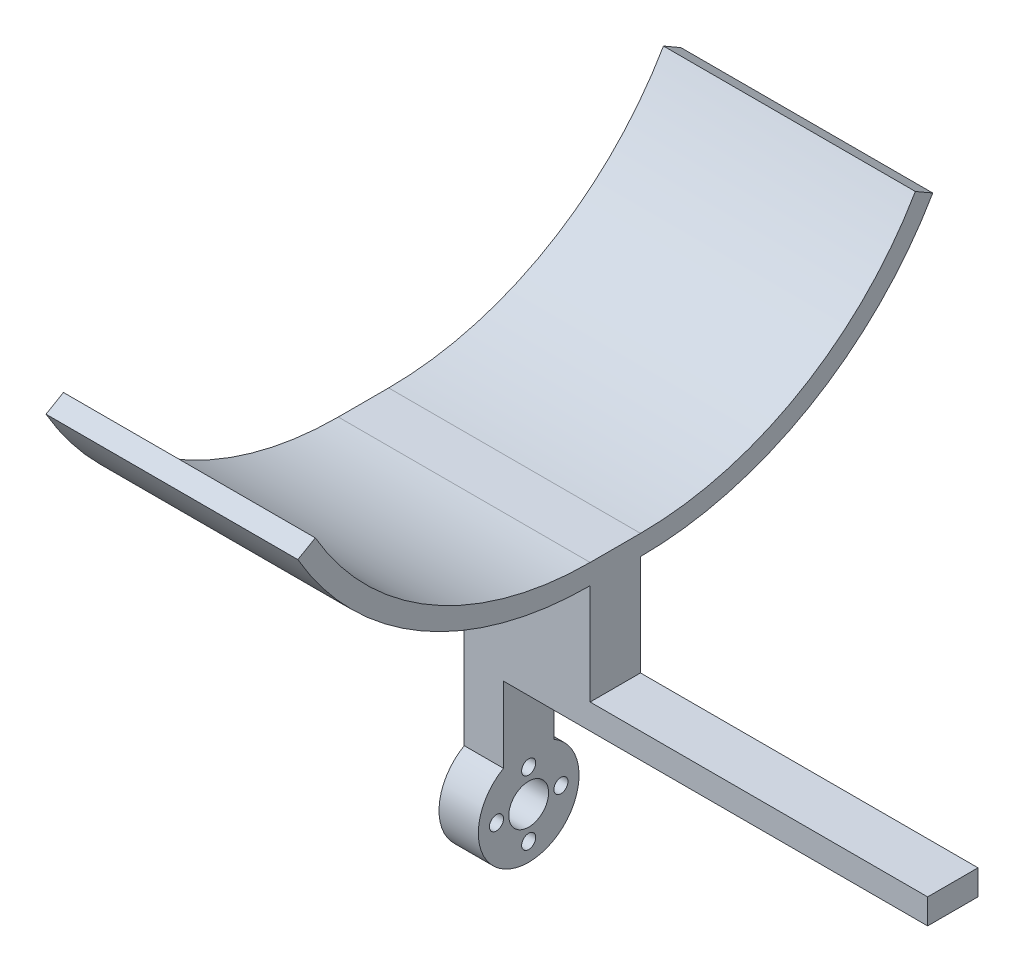
ISO-10303-21;
HEADER;
FILE_DESCRIPTION(('STEP AP214'),'2;1');
FILE_NAME('part.step','',(''),(''),'','','');
FILE_SCHEMA(('AUTOMOTIVE_DESIGN { 1 0 10303 214 1 1 1 1 }'));
ENDSEC;
DATA;
#1=APPLICATION_CONTEXT('core data for automotive mechanical design processes');
#2=APPLICATION_PROTOCOL_DEFINITION('international standard','automotive_design',2000,#1);
#3=PRODUCT_CONTEXT('',#1,'mechanical');
#4=PRODUCT('Part','Part','',(#3));
#5=PRODUCT_RELATED_PRODUCT_CATEGORY('part','',(#4));
#6=PRODUCT_DEFINITION_FORMATION('','',#4);
#7=PRODUCT_DEFINITION_CONTEXT('part definition',#1,'design');
#8=PRODUCT_DEFINITION('design','',#6,#7);
#9=PRODUCT_DEFINITION_SHAPE('','',#8);
#10=(LENGTH_UNIT() NAMED_UNIT(*) SI_UNIT(.MILLI.,.METRE.));
#11=(NAMED_UNIT(*) PLANE_ANGLE_UNIT() SI_UNIT($,.RADIAN.));
#12=(NAMED_UNIT(*) SI_UNIT($,.STERADIAN.) SOLID_ANGLE_UNIT());
#13=UNCERTAINTY_MEASURE_WITH_UNIT(LENGTH_MEASURE(1.E-05),#10,'distance_accuracy_value','');
#14=(GEOMETRIC_REPRESENTATION_CONTEXT(3) GLOBAL_UNCERTAINTY_ASSIGNED_CONTEXT((#13)) GLOBAL_UNIT_ASSIGNED_CONTEXT((#10,
#11,#12)) REPRESENTATION_CONTEXT('',''));
#15=CARTESIAN_POINT('',(0.,0.,0.));
#16=DIRECTION('',(0.,0.,1.));
#17=DIRECTION('',(1.,0.,0.));
#18=AXIS2_PLACEMENT_3D('',#15,#16,#17);
#19=CARTESIAN_POINT('',(0.,0.,0.));
#20=DIRECTION('',(1.,0.,0.));
#21=DIRECTION('',(0.,0.,-1.));
#22=AXIS2_PLACEMENT_3D('',#19,#20,#21);
#23=PLANE('',#22);
#24=CARTESIAN_POINT('',(0.,8.128,0.));
#25=DIRECTION('',(1.,0.,0.));
#26=DIRECTION('',(0.,0.,-1.));
#27=AXIS2_PLACEMENT_3D('',#24,#25,#26);
#28=CIRCLE('',#27,1.778);
#29=CARTESIAN_POINT('',(0.,8.128,-1.778));
#30=VERTEX_POINT('',#29);
#31=EDGE_CURVE('E293',#30,#30,#28,.T.);
#32=ORIENTED_EDGE('',*,*,#31,.T.);
#33=EDGE_LOOP('',(#32));
#34=FACE_BOUND('',#33,.T.);
#35=CARTESIAN_POINT('',(0.,-8.128,0.));
#36=DIRECTION('',(1.,0.,0.));
#37=DIRECTION('',(0.,0.,-1.));
#38=AXIS2_PLACEMENT_3D('',#35,#36,#37);
#39=CIRCLE('',#38,1.778);
#40=CARTESIAN_POINT('',(0.,-8.128,-1.778));
#41=VERTEX_POINT('',#40);
#42=EDGE_CURVE('E312',#41,#41,#39,.T.);
#43=ORIENTED_EDGE('',*,*,#42,.T.);
#44=EDGE_LOOP('',(#43));
#45=FACE_BOUND('',#44,.T.);
#46=CARTESIAN_POINT('',(0.,0.,-8.128));
#47=DIRECTION('',(1.,0.,0.));
#48=DIRECTION('',(0.,0.,-1.));
#49=AXIS2_PLACEMENT_3D('',#46,#47,#48);
#50=CIRCLE('',#49,1.778);
#51=CARTESIAN_POINT('',(0.,0.,-9.906));
#52=VERTEX_POINT('',#51);
#53=EDGE_CURVE('E320',#52,#52,#50,.T.);
#54=ORIENTED_EDGE('',*,*,#53,.T.);
#55=EDGE_LOOP('',(#54));
#56=FACE_BOUND('',#55,.T.);
#57=CARTESIAN_POINT('',(0.,0.,8.128));
#58=DIRECTION('',(1.,0.,0.));
#59=DIRECTION('',(0.,0.,-1.));
#60=AXIS2_PLACEMENT_3D('',#57,#58,#59);
#61=CIRCLE('',#60,1.77800000000001);
#62=CARTESIAN_POINT('',(0.,0.,6.34999999999999));
#63=VERTEX_POINT('',#62);
#64=EDGE_CURVE('E328',#63,#63,#61,.T.);
#65=ORIENTED_EDGE('',*,*,#64,.T.);
#66=EDGE_LOOP('',(#65));
#67=FACE_BOUND('',#66,.T.);
#68=CARTESIAN_POINT('',(0.,0.,0.));
#69=DIRECTION('',(1.,0.,0.));
#70=DIRECTION('',(0.,0.,-1.));
#71=AXIS2_PLACEMENT_3D('',#68,#69,#70);
#72=CIRCLE('',#71,5.0165);
#73=CARTESIAN_POINT('',(0.,0.,-5.0165));
#74=VERTEX_POINT('',#73);
#75=EDGE_CURVE('E336',#74,#74,#72,.T.);
#76=ORIENTED_EDGE('',*,*,#75,.T.);
#77=EDGE_LOOP('',(#76));
#78=FACE_BOUND('',#77,.T.);
#79=DIRECTION('',(0.,0.,1.));
#80=VECTOR('',#79,1.);
#81=CARTESIAN_POINT('',(0.,36.3985226280624,0.));
#82=LINE('',#81,#80);
#83=CARTESIAN_POINT('',(0.,36.3985226280624,-6.35));
#84=VERTEX_POINT('',#83);
#85=CARTESIAN_POINT('',(0.,36.3985226280624,6.35));
#86=VERTEX_POINT('',#85);
#87=EDGE_CURVE('E199',#84,#86,#82,.T.);
#88=ORIENTED_EDGE('',*,*,#87,.F.);
#89=DIRECTION('',(0.,1.,0.));
#90=VECTOR('',#89,1.);
#91=CARTESIAN_POINT('',(0.,10.9985226280624,-6.35));
#92=LINE('',#91,#90);
#93=CARTESIAN_POINT('',(0.,10.9985226280624,-6.34999999999999));
#94=VERTEX_POINT('',#93);
#95=EDGE_CURVE('E165',#94,#84,#92,.T.);
#96=ORIENTED_EDGE('',*,*,#95,.F.);
#97=CARTESIAN_POINT('',(0.,0.,0.));
#98=DIRECTION('',(1.,0.,0.));
#99=DIRECTION('',(0.,0.,-1.));
#100=AXIS2_PLACEMENT_3D('',#97,#98,#99);
#101=CIRCLE('',#100,12.7);
#102=CARTESIAN_POINT('',(0.,10.9985226280624,6.35));
#103=VERTEX_POINT('',#102);
#104=EDGE_CURVE('E350',#103,#94,#101,.T.);
#105=ORIENTED_EDGE('',*,*,#104,.F.);
#106=DIRECTION('',(0.,-1.,0.));
#107=VECTOR('',#106,1.);
#108=CARTESIAN_POINT('',(0.,10.9985226280624,6.35));
#109=LINE('',#108,#107);
#110=EDGE_CURVE('E359',#86,#103,#109,.T.);
#111=ORIENTED_EDGE('',*,*,#110,.F.);
#112=EDGE_LOOP('',(#88,#96,#105,#111));
#113=FACE_BOUND('',#112,.T.);
#114=ADVANCED_FACE('F45',(#34,#45,#56,#67,#78,#113),#23,.F.);
#115=CARTESIAN_POINT('',(9.906,0.,0.));
#116=DIRECTION('',(1.,0.,0.));
#117=DIRECTION('',(0.,0.,-1.));
#118=AXIS2_PLACEMENT_3D('',#115,#116,#117);
#119=PLANE('',#118);
#120=DIRECTION('',(0.,0.,1.));
#121=VECTOR('',#120,1.);
#122=CARTESIAN_POINT('',(9.906,30.0485226280624,-6.35));
#123=LINE('',#122,#121);
#124=CARTESIAN_POINT('',(9.906,30.0485226280624,-6.35));
#125=VERTEX_POINT('',#124);
#126=CARTESIAN_POINT('',(9.906,30.0485226280624,6.35));
#127=VERTEX_POINT('',#126);
#128=EDGE_CURVE('E207',#125,#127,#123,.T.);
#129=ORIENTED_EDGE('',*,*,#128,.T.);
#130=DIRECTION('',(0.,-1.,0.));
#131=VECTOR('',#130,1.);
#132=CARTESIAN_POINT('',(9.906,10.9985226280624,6.35));
#133=LINE('',#132,#131);
#134=CARTESIAN_POINT('',(9.906,10.9985226280624,6.35));
#135=VERTEX_POINT('',#134);
#136=EDGE_CURVE('E349',#127,#135,#133,.T.);
#137=ORIENTED_EDGE('',*,*,#136,.T.);
#138=CARTESIAN_POINT('',(9.906,0.,0.));
#139=DIRECTION('',(1.,0.,0.));
#140=DIRECTION('',(0.,0.,-1.));
#141=AXIS2_PLACEMENT_3D('',#138,#139,#140);
#142=CIRCLE('',#141,12.7);
#143=CARTESIAN_POINT('',(9.906,10.9985226280624,-6.34999999999999));
#144=VERTEX_POINT('',#143);
#145=EDGE_CURVE('E353',#135,#144,#142,.T.);
#146=ORIENTED_EDGE('',*,*,#145,.T.);
#147=DIRECTION('',(0.,1.,0.));
#148=VECTOR('',#147,1.);
#149=CARTESIAN_POINT('',(9.906,10.9985226280624,-6.35));
#150=LINE('',#149,#148);
#151=EDGE_CURVE('E69',#144,#125,#150,.T.);
#152=ORIENTED_EDGE('',*,*,#151,.T.);
#153=EDGE_LOOP('',(#129,#137,#146,#152));
#154=FACE_BOUND('',#153,.T.);
#155=CARTESIAN_POINT('',(9.906,-8.128,0.));
#156=DIRECTION('',(1.,0.,0.));
#157=DIRECTION('',(0.,0.,-1.));
#158=AXIS2_PLACEMENT_3D('',#155,#156,#157);
#159=CIRCLE('',#158,1.778);
#160=CARTESIAN_POINT('',(9.906,-8.128,-1.778));
#161=VERTEX_POINT('',#160);
#162=EDGE_CURVE('E316',#161,#161,#159,.T.);
#163=ORIENTED_EDGE('',*,*,#162,.F.);
#164=EDGE_LOOP('',(#163));
#165=FACE_BOUND('',#164,.T.);
#166=CARTESIAN_POINT('',(9.906,0.,8.128));
#167=DIRECTION('',(1.,0.,0.));
#168=DIRECTION('',(0.,0.,-1.));
#169=AXIS2_PLACEMENT_3D('',#166,#167,#168);
#170=CIRCLE('',#169,1.77800000000001);
#171=CARTESIAN_POINT('',(9.906,0.,6.34999999999999));
#172=VERTEX_POINT('',#171);
#173=EDGE_CURVE('E332',#172,#172,#170,.T.);
#174=ORIENTED_EDGE('',*,*,#173,.F.);
#175=EDGE_LOOP('',(#174));
#176=FACE_BOUND('',#175,.T.);
#177=CARTESIAN_POINT('',(9.906,0.,0.));
#178=DIRECTION('',(1.,0.,0.));
#179=DIRECTION('',(0.,0.,-1.));
#180=AXIS2_PLACEMENT_3D('',#177,#178,#179);
#181=CIRCLE('',#180,5.0165);
#182=CARTESIAN_POINT('',(9.906,0.,-5.0165));
#183=VERTEX_POINT('',#182);
#184=EDGE_CURVE('E340',#183,#183,#181,.T.);
#185=ORIENTED_EDGE('',*,*,#184,.F.);
#186=EDGE_LOOP('',(#185));
#187=FACE_BOUND('',#186,.T.);
#188=CARTESIAN_POINT('',(9.906,0.,-8.128));
#189=DIRECTION('',(1.,0.,0.));
#190=DIRECTION('',(0.,0.,-1.));
#191=AXIS2_PLACEMENT_3D('',#188,#189,#190);
#192=CIRCLE('',#191,1.778);
#193=CARTESIAN_POINT('',(9.906,0.,-9.906));
#194=VERTEX_POINT('',#193);
#195=EDGE_CURVE('E324',#194,#194,#192,.T.);
#196=ORIENTED_EDGE('',*,*,#195,.F.);
#197=EDGE_LOOP('',(#196));
#198=FACE_BOUND('',#197,.T.);
#199=CARTESIAN_POINT('',(9.906,8.128,0.));
#200=DIRECTION('',(1.,0.,0.));
#201=DIRECTION('',(0.,0.,-1.));
#202=AXIS2_PLACEMENT_3D('',#199,#200,#201);
#203=CIRCLE('',#202,1.778);
#204=CARTESIAN_POINT('',(9.906,8.128,-1.778));
#205=VERTEX_POINT('',#204);
#206=EDGE_CURVE('E308',#205,#205,#203,.T.);
#207=ORIENTED_EDGE('',*,*,#206,.F.);
#208=EDGE_LOOP('',(#207));
#209=FACE_BOUND('',#208,.T.);
#210=ADVANCED_FACE('F415',(#154,#165,#176,#187,#198,#209),#119,.T.);
#211=CARTESIAN_POINT('',(9.906,10.9985226280624,-6.35));
#212=DIRECTION('',(0.,0.,1.));
#213=DIRECTION('',(1.,0.,0.));
#214=AXIS2_PLACEMENT_3D('',#211,#212,#213);
#215=PLANE('',#214);
#216=DIRECTION('',(-1.,0.,0.));
#217=VECTOR('',#216,1.);
#218=CARTESIAN_POINT('',(9.906,61.7985226280624,-6.35));
#219=LINE('',#218,#217);
#220=CARTESIAN_POINT('',(31.75,61.7985226280624,-6.35));
#221=VERTEX_POINT('',#220);
#222=CARTESIAN_POINT('',(-31.75,61.7985226280624,-6.35));
#223=VERTEX_POINT('',#222);
#224=EDGE_CURVE('E11',#221,#223,#219,.T.);
#225=ORIENTED_EDGE('',*,*,#224,.F.);
#226=DIRECTION('',(0.,1.,0.));
#227=VECTOR('',#226,1.);
#228=CARTESIAN_POINT('',(31.75,36.3985226280624,-6.35));
#229=LINE('',#228,#227);
#230=CARTESIAN_POINT('',(31.75,36.3985226280624,-6.35));
#231=VERTEX_POINT('',#230);
#232=EDGE_CURVE('E195',#231,#221,#229,.T.);
#233=ORIENTED_EDGE('',*,*,#232,.F.);
#234=DIRECTION('',(-1.,0.,0.));
#235=VECTOR('',#234,1.);
#236=CARTESIAN_POINT('',(116.84,36.3985226280624,-6.35));
#237=LINE('',#236,#235);
#238=CARTESIAN_POINT('',(116.84,36.3985226280624,-6.35));
#239=VERTEX_POINT('',#238);
#240=EDGE_CURVE('E235',#239,#231,#237,.T.);
#241=ORIENTED_EDGE('',*,*,#240,.F.);
#242=DIRECTION('',(0.,-1.,0.));
#243=VECTOR('',#242,1.);
#244=CARTESIAN_POINT('',(116.84,30.0485226280624,-6.35));
#245=LINE('',#244,#243);
#246=CARTESIAN_POINT('',(116.84,30.0485226280624,-6.35));
#247=VERTEX_POINT('',#246);
#248=EDGE_CURVE('E216',#239,#247,#245,.T.);
#249=ORIENTED_EDGE('',*,*,#248,.T.);
#250=DIRECTION('',(-1.,0.,0.));
#251=VECTOR('',#250,1.);
#252=CARTESIAN_POINT('',(116.84,30.0485226280624,-6.35));
#253=LINE('',#252,#251);
#254=EDGE_CURVE('E232',#247,#125,#253,.T.);
#255=ORIENTED_EDGE('',*,*,#254,.T.);
#256=ORIENTED_EDGE('',*,*,#151,.F.);
#257=DIRECTION('',(-1.,0.,0.));
#258=VECTOR('',#257,1.);
#259=CARTESIAN_POINT('',(9.906,10.9985226280624,-6.34999999999999));
#260=LINE('',#259,#258);
#261=EDGE_CURVE('E356',#144,#94,#260,.T.);
#262=ORIENTED_EDGE('',*,*,#261,.T.);
#263=ORIENTED_EDGE('',*,*,#95,.T.);
#264=DIRECTION('',(-1.,0.,0.));
#265=VECTOR('',#264,1.);
#266=CARTESIAN_POINT('',(60.1480633142473,36.3985226280624,-6.35));
#267=LINE('',#266,#265);
#268=CARTESIAN_POINT('',(-31.75,36.3985226280624,-6.35));
#269=VERTEX_POINT('',#268);
#270=EDGE_CURVE('E159',#84,#269,#267,.T.);
#271=ORIENTED_EDGE('',*,*,#270,.T.);
#272=DIRECTION('',(0.,-1.,0.));
#273=VECTOR('',#272,1.);
#274=CARTESIAN_POINT('',(-31.75,36.3985226280624,-6.35));
#275=LINE('',#274,#273);
#276=EDGE_CURVE('E161',#223,#269,#275,.T.);
#277=ORIENTED_EDGE('',*,*,#276,.F.);
#278=EDGE_LOOP('',(#225,#233,#241,#249,#255,#256,#262,#263,#271,#277));
#279=FACE_BOUND('',#278,.T.);
#280=ADVANCED_FACE('F47',(#279),#215,.F.);
#281=CARTESIAN_POINT('',(9.906,10.9985226280624,6.35));
#282=DIRECTION('',(0.,0.,-1.));
#283=DIRECTION('',(-1.,0.,0.));
#284=AXIS2_PLACEMENT_3D('',#281,#282,#283);
#285=PLANE('',#284);
#286=DIRECTION('',(-1.,0.,0.));
#287=VECTOR('',#286,1.);
#288=CARTESIAN_POINT('',(9.906,61.7985226280624,6.35));
#289=LINE('',#288,#287);
#290=CARTESIAN_POINT('',(31.75,61.7985226280624,6.35));
#291=VERTEX_POINT('',#290);
#292=CARTESIAN_POINT('',(-31.75,61.7985226280624,6.35));
#293=VERTEX_POINT('',#292);
#294=EDGE_CURVE('E54',#291,#293,#289,.T.);
#295=ORIENTED_EDGE('',*,*,#294,.T.);
#296=DIRECTION('',(0.,1.,0.));
#297=VECTOR('',#296,1.);
#298=CARTESIAN_POINT('',(-31.75,36.3985226280624,6.35));
#299=LINE('',#298,#297);
#300=CARTESIAN_POINT('',(-31.75,36.3985226280624,6.35));
#301=VERTEX_POINT('',#300);
#302=EDGE_CURVE('E184',#301,#293,#299,.T.);
#303=ORIENTED_EDGE('',*,*,#302,.F.);
#304=DIRECTION('',(-1.,0.,0.));
#305=VECTOR('',#304,1.);
#306=CARTESIAN_POINT('',(60.1480633142473,36.3985226280624,6.35));
#307=LINE('',#306,#305);
#308=EDGE_CURVE('E171',#86,#301,#307,.T.);
#309=ORIENTED_EDGE('',*,*,#308,.F.);
#310=ORIENTED_EDGE('',*,*,#110,.T.);
#311=DIRECTION('',(-1.,0.,0.));
#312=VECTOR('',#311,1.);
#313=CARTESIAN_POINT('',(9.906,10.9985226280624,6.35));
#314=LINE('',#313,#312);
#315=EDGE_CURVE('E366',#135,#103,#314,.T.);
#316=ORIENTED_EDGE('',*,*,#315,.F.);
#317=ORIENTED_EDGE('',*,*,#136,.F.);
#318=DIRECTION('',(-1.,0.,0.));
#319=VECTOR('',#318,1.);
#320=CARTESIAN_POINT('',(116.84,30.0485226280624,6.35));
#321=LINE('',#320,#319);
#322=CARTESIAN_POINT('',(116.84,30.0485226280624,6.35));
#323=VERTEX_POINT('',#322);
#324=EDGE_CURVE('E227',#323,#127,#321,.T.);
#325=ORIENTED_EDGE('',*,*,#324,.F.);
#326=DIRECTION('',(0.,1.,0.));
#327=VECTOR('',#326,1.);
#328=CARTESIAN_POINT('',(116.84,30.0485226280624,6.35));
#329=LINE('',#328,#327);
#330=CARTESIAN_POINT('',(116.84,36.3985226280624,6.35));
#331=VERTEX_POINT('',#330);
#332=EDGE_CURVE('E208',#323,#331,#329,.T.);
#333=ORIENTED_EDGE('',*,*,#332,.T.);
#334=DIRECTION('',(-1.,0.,0.));
#335=VECTOR('',#334,1.);
#336=CARTESIAN_POINT('',(116.84,36.3985226280624,6.35));
#337=LINE('',#336,#335);
#338=CARTESIAN_POINT('',(31.75,36.3985226280624,6.35));
#339=VERTEX_POINT('',#338);
#340=EDGE_CURVE('E224',#331,#339,#337,.T.);
#341=ORIENTED_EDGE('',*,*,#340,.T.);
#342=DIRECTION('',(0.,-1.,0.));
#343=VECTOR('',#342,1.);
#344=CARTESIAN_POINT('',(31.75,36.3985226280624,6.35));
#345=LINE('',#344,#343);
#346=EDGE_CURVE('E170',#291,#339,#345,.T.);
#347=ORIENTED_EDGE('',*,*,#346,.F.);
#348=EDGE_LOOP('',(#295,#303,#309,#310,#316,#317,#325,#333,#341,#347));
#349=FACE_BOUND('',#348,.T.);
#350=ADVANCED_FACE('F372',(#349),#285,.F.);
#351=CARTESIAN_POINT('',(9.906,0.,0.));
#352=DIRECTION('',(-1.,0.,0.));
#353=DIRECTION('',(0.,0.,1.));
#354=AXIS2_PLACEMENT_3D('',#351,#352,#353);
#355=CYLINDRICAL_SURFACE('',#354,12.7);
#356=ORIENTED_EDGE('',*,*,#104,.T.);
#357=ORIENTED_EDGE('',*,*,#261,.F.);
#358=ORIENTED_EDGE('',*,*,#145,.F.);
#359=ORIENTED_EDGE('',*,*,#315,.T.);
#360=EDGE_LOOP('',(#356,#357,#358,#359));
#361=FACE_BOUND('',#360,.T.);
#362=ADVANCED_FACE('F425',(#361),#355,.T.);
#363=CARTESIAN_POINT('',(9.906,0.,0.));
#364=DIRECTION('',(-1.,0.,0.));
#365=DIRECTION('',(0.,0.,1.));
#366=AXIS2_PLACEMENT_3D('',#363,#364,#365);
#367=CYLINDRICAL_SURFACE('',#366,5.0165);
#368=ORIENTED_EDGE('',*,*,#184,.T.);
#369=EDGE_LOOP('',(#368));
#370=FACE_BOUND('',#369,.T.);
#371=ORIENTED_EDGE('',*,*,#75,.F.);
#372=EDGE_LOOP('',(#371));
#373=FACE_BOUND('',#372,.T.);
#374=ADVANCED_FACE('F427',(#370,#373),#367,.F.);
#375=CARTESIAN_POINT('',(9.906,0.,8.128));
#376=DIRECTION('',(-1.,0.,0.));
#377=DIRECTION('',(0.,0.,1.));
#378=AXIS2_PLACEMENT_3D('',#375,#376,#377);
#379=CYLINDRICAL_SURFACE('',#378,1.77800000000001);
#380=ORIENTED_EDGE('',*,*,#173,.T.);
#381=EDGE_LOOP('',(#380));
#382=FACE_BOUND('',#381,.T.);
#383=ORIENTED_EDGE('',*,*,#64,.F.);
#384=EDGE_LOOP('',(#383));
#385=FACE_BOUND('',#384,.T.);
#386=ADVANCED_FACE('F553',(#382,#385),#379,.F.);
#387=CARTESIAN_POINT('',(9.906,0.,-8.128));
#388=DIRECTION('',(-1.,0.,0.));
#389=DIRECTION('',(0.,0.,1.));
#390=AXIS2_PLACEMENT_3D('',#387,#388,#389);
#391=CYLINDRICAL_SURFACE('',#390,1.778);
#392=ORIENTED_EDGE('',*,*,#195,.T.);
#393=EDGE_LOOP('',(#392));
#394=FACE_BOUND('',#393,.T.);
#395=ORIENTED_EDGE('',*,*,#53,.F.);
#396=EDGE_LOOP('',(#395));
#397=FACE_BOUND('',#396,.T.);
#398=ADVANCED_FACE('F563',(#394,#397),#391,.F.);
#399=CARTESIAN_POINT('',(9.906,-8.128,0.));
#400=DIRECTION('',(-1.,0.,0.));
#401=DIRECTION('',(0.,0.,1.));
#402=AXIS2_PLACEMENT_3D('',#399,#400,#401);
#403=CYLINDRICAL_SURFACE('',#402,1.778);
#404=ORIENTED_EDGE('',*,*,#162,.T.);
#405=EDGE_LOOP('',(#404));
#406=FACE_BOUND('',#405,.T.);
#407=ORIENTED_EDGE('',*,*,#42,.F.);
#408=EDGE_LOOP('',(#407));
#409=FACE_BOUND('',#408,.T.);
#410=ADVANCED_FACE('F574',(#406,#409),#403,.F.);
#411=CARTESIAN_POINT('',(9.906,8.128,0.));
#412=DIRECTION('',(-1.,0.,0.));
#413=DIRECTION('',(0.,0.,1.));
#414=AXIS2_PLACEMENT_3D('',#411,#412,#413);
#415=CYLINDRICAL_SURFACE('',#414,1.778);
#416=ORIENTED_EDGE('',*,*,#206,.T.);
#417=EDGE_LOOP('',(#416));
#418=FACE_BOUND('',#417,.T.);
#419=ORIENTED_EDGE('',*,*,#31,.F.);
#420=EDGE_LOOP('',(#419));
#421=FACE_BOUND('',#420,.T.);
#422=ADVANCED_FACE('F585',(#418,#421),#415,.F.);
#423=CARTESIAN_POINT('',(-31.75,146.888522628062,6.35));
#424=DIRECTION('',(1.,0.,0.));
#425=DIRECTION('',(0.,0.,-1.));
#426=AXIS2_PLACEMENT_3D('',#423,#424,#425);
#427=CYLINDRICAL_SURFACE('',#426,80.01);
#428=DIRECTION('',(1.,0.,0.));
#429=VECTOR('',#428,1.);
#430=CARTESIAN_POINT('',(-31.75,106.883522628063,75.6406925567932));
#431=LINE('',#430,#429);
#432=CARTESIAN_POINT('',(-31.75,106.883522628063,75.6406925567932));
#433=VERTEX_POINT('',#432);
#434=CARTESIAN_POINT('',(31.75,106.883522628063,75.6406925567932));
#435=VERTEX_POINT('',#434);
#436=EDGE_CURVE('E289',#433,#435,#431,.T.);
#437=ORIENTED_EDGE('',*,*,#436,.T.);
#438=CARTESIAN_POINT('',(31.75,146.888522628062,6.35));
#439=DIRECTION('',(1.,0.,0.));
#440=DIRECTION('',(0.,0.,-1.));
#441=AXIS2_PLACEMENT_3D('',#438,#439,#440);
#442=CIRCLE('',#441,80.01);
#443=CARTESIAN_POINT('',(31.75,66.8785226280624,6.35));
#444=VERTEX_POINT('',#443);
#445=EDGE_CURVE('E231',#435,#444,#442,.T.);
#446=ORIENTED_EDGE('',*,*,#445,.T.);
#447=DIRECTION('',(1.,0.,0.));
#448=VECTOR('',#447,1.);
#449=CARTESIAN_POINT('',(-31.75,66.8785226280624,6.35));
#450=LINE('',#449,#448);
#451=CARTESIAN_POINT('',(-31.75,66.8785226280624,6.35));
#452=VERTEX_POINT('',#451);
#453=EDGE_CURVE('E290',#452,#444,#450,.T.);
#454=ORIENTED_EDGE('',*,*,#453,.F.);
#455=CARTESIAN_POINT('',(-31.75,146.888522628062,6.35));
#456=DIRECTION('',(1.,0.,0.));
#457=DIRECTION('',(0.,0.,-1.));
#458=AXIS2_PLACEMENT_3D('',#455,#456,#457);
#459=CIRCLE('',#458,80.01);
#460=EDGE_CURVE('E267',#433,#452,#459,.T.);
#461=ORIENTED_EDGE('',*,*,#460,.F.);
#462=EDGE_LOOP('',(#437,#446,#454,#461));
#463=FACE_BOUND('',#462,.T.);
#464=ADVANCED_FACE('F386',(#463),#427,.F.);
#465=CARTESIAN_POINT('',(-31.75,66.8785226280623,-2.92323132577123E-13));
#466=DIRECTION('',(0.,-1.,0.));
#467=DIRECTION('',(0.,0.,-1.));
#468=AXIS2_PLACEMENT_3D('',#465,#466,#467);
#469=PLANE('',#468);
#470=ORIENTED_EDGE('',*,*,#453,.T.);
#471=DIRECTION('',(0.,0.,-1.));
#472=VECTOR('',#471,1.);
#473=CARTESIAN_POINT('',(31.75,66.8785226280623,-2.92323132577123E-13));
#474=LINE('',#473,#472);
#475=CARTESIAN_POINT('',(31.75,66.8785226280623,-6.35));
#476=VERTEX_POINT('',#475);
#477=EDGE_CURVE('E263',#444,#476,#474,.T.);
#478=ORIENTED_EDGE('',*,*,#477,.T.);
#479=DIRECTION('',(1.,0.,0.));
#480=VECTOR('',#479,1.);
#481=CARTESIAN_POINT('',(-31.75,66.8785226280623,-6.35));
#482=LINE('',#481,#480);
#483=CARTESIAN_POINT('',(-31.75,66.8785226280623,-6.35));
#484=VERTEX_POINT('',#483);
#485=EDGE_CURVE('E294',#484,#476,#482,.T.);
#486=ORIENTED_EDGE('',*,*,#485,.F.);
#487=DIRECTION('',(0.,0.,-1.));
#488=VECTOR('',#487,1.);
#489=CARTESIAN_POINT('',(-31.75,66.8785226280623,-2.92323132577123E-13));
#490=LINE('',#489,#488);
#491=EDGE_CURVE('E286',#452,#484,#490,.T.);
#492=ORIENTED_EDGE('',*,*,#491,.F.);
#493=EDGE_LOOP('',(#470,#478,#486,#492));
#494=FACE_BOUND('',#493,.T.);
#495=ADVANCED_FACE('F390',(#494),#469,.F.);
#496=CARTESIAN_POINT('',(-31.75,146.888522628062,-6.34999999999999));
#497=DIRECTION('',(1.,0.,0.));
#498=DIRECTION('',(0.,0.,-1.));
#499=AXIS2_PLACEMENT_3D('',#496,#497,#498);
#500=CYLINDRICAL_SURFACE('',#499,80.01);
#501=ORIENTED_EDGE('',*,*,#485,.T.);
#502=CARTESIAN_POINT('',(31.75,146.888522628062,-6.34999999999999));
#503=DIRECTION('',(1.,0.,0.));
#504=DIRECTION('',(0.,0.,-1.));
#505=AXIS2_PLACEMENT_3D('',#502,#503,#504);
#506=CIRCLE('',#505,80.01);
#507=CARTESIAN_POINT('',(31.75,106.883522628062,-75.6406925567929));
#508=VERTEX_POINT('',#507);
#509=EDGE_CURVE('E259',#476,#508,#506,.T.);
#510=ORIENTED_EDGE('',*,*,#509,.T.);
#511=DIRECTION('',(1.,0.,0.));
#512=VECTOR('',#511,1.);
#513=CARTESIAN_POINT('',(-31.75,106.883522628062,-75.6406925567929));
#514=LINE('',#513,#512);
#515=CARTESIAN_POINT('',(-31.75,106.883522628062,-75.6406925567929));
#516=VERTEX_POINT('',#515);
#517=EDGE_CURVE('E297',#516,#508,#514,.T.);
#518=ORIENTED_EDGE('',*,*,#517,.F.);
#519=CARTESIAN_POINT('',(-31.75,146.888522628062,-6.34999999999999));
#520=DIRECTION('',(1.,0.,0.));
#521=DIRECTION('',(0.,0.,-1.));
#522=AXIS2_PLACEMENT_3D('',#519,#520,#521);
#523=CIRCLE('',#522,80.01);
#524=EDGE_CURVE('E283',#484,#516,#523,.T.);
#525=ORIENTED_EDGE('',*,*,#524,.F.);
#526=EDGE_LOOP('',(#501,#510,#518,#525));
#527=FACE_BOUND('',#526,.T.);
#528=ADVANCED_FACE('F395',(#527),#500,.F.);
#529=CARTESIAN_POINT('',(-31.75,112.916022628062,-65.192096060134));
#530=DIRECTION('',(0.,0.866025403784437,-0.500000000000003));
#531=DIRECTION('',(0.,0.500000000000003,0.866025403784437));
#532=AXIS2_PLACEMENT_3D('',#529,#530,#531);
#533=PLANE('',#532);
#534=ORIENTED_EDGE('',*,*,#517,.T.);
#535=DIRECTION('',(0.,0.500000000000003,0.866025403784437));
#536=VECTOR('',#535,1.);
#537=CARTESIAN_POINT('',(31.75,112.916022628062,-65.192096060134));
#538=LINE('',#537,#536);
#539=CARTESIAN_POINT('',(31.75,104.343522628062,-80.0401016080178));
#540=VERTEX_POINT('',#539);
#541=EDGE_CURVE('E255',#540,#508,#538,.T.);
#542=ORIENTED_EDGE('',*,*,#541,.F.);
#543=DIRECTION('',(1.,0.,0.));
#544=VECTOR('',#543,1.);
#545=CARTESIAN_POINT('',(-31.75,104.343522628062,-80.0401016080178));
#546=LINE('',#545,#544);
#547=CARTESIAN_POINT('',(-31.75,104.343522628062,-80.0401016080178));
#548=VERTEX_POINT('',#547);
#549=EDGE_CURVE('E300',#548,#540,#546,.T.);
#550=ORIENTED_EDGE('',*,*,#549,.F.);
#551=DIRECTION('',(0.,0.500000000000003,0.866025403784437));
#552=VECTOR('',#551,1.);
#553=CARTESIAN_POINT('',(-31.75,112.916022628062,-65.192096060134));
#554=LINE('',#553,#552);
#555=EDGE_CURVE('E279',#548,#516,#554,.T.);
#556=ORIENTED_EDGE('',*,*,#555,.T.);
#557=EDGE_LOOP('',(#534,#542,#550,#556));
#558=FACE_BOUND('',#557,.T.);
#559=ADVANCED_FACE('F405',(#558),#533,.T.);
#560=CARTESIAN_POINT('',(-31.75,146.888522628062,-6.34999999999999));
#561=DIRECTION('',(1.,0.,0.));
#562=DIRECTION('',(0.,0.,-1.));
#563=AXIS2_PLACEMENT_3D('',#560,#561,#562);
#564=CYLINDRICAL_SURFACE('',#563,85.09);
#565=ORIENTED_EDGE('',*,*,#549,.T.);
#566=CARTESIAN_POINT('',(31.75,146.888522628062,-6.34999999999999));
#567=DIRECTION('',(1.,0.,0.));
#568=DIRECTION('',(0.,0.,-1.));
#569=AXIS2_PLACEMENT_3D('',#566,#567,#568);
#570=CIRCLE('',#569,85.09);
#571=EDGE_CURVE('E251',#221,#540,#570,.T.);
#572=ORIENTED_EDGE('',*,*,#571,.F.);
#573=ORIENTED_EDGE('',*,*,#224,.T.);
#574=CARTESIAN_POINT('',(-31.75,146.888522628062,-6.34999999999999));
#575=DIRECTION('',(1.,0.,0.));
#576=DIRECTION('',(0.,0.,-1.));
#577=AXIS2_PLACEMENT_3D('',#574,#575,#576);
#578=CIRCLE('',#577,85.09);
#579=EDGE_CURVE('E182',#223,#548,#578,.T.);
#580=ORIENTED_EDGE('',*,*,#579,.T.);
#581=EDGE_LOOP('',(#565,#572,#573,#580));
#582=FACE_BOUND('',#581,.T.);
#583=ADVANCED_FACE('F398',(#582),#564,.T.);
#584=CARTESIAN_POINT('',(-31.75,146.888522628062,6.35));
#585=DIRECTION('',(1.,0.,0.));
#586=DIRECTION('',(0.,0.,-1.));
#587=AXIS2_PLACEMENT_3D('',#584,#585,#586);
#588=CYLINDRICAL_SURFACE('',#587,85.09);
#589=CARTESIAN_POINT('',(-31.75,146.888522628062,6.35));
#590=DIRECTION('',(1.,0.,0.));
#591=DIRECTION('',(0.,0.,-1.));
#592=AXIS2_PLACEMENT_3D('',#589,#590,#591);
#593=CIRCLE('',#592,85.09);
#594=CARTESIAN_POINT('',(-31.75,104.343522628063,80.0401016080181));
#595=VERTEX_POINT('',#594);
#596=EDGE_CURVE('E273',#595,#293,#593,.T.);
#597=ORIENTED_EDGE('',*,*,#596,.T.);
#598=ORIENTED_EDGE('',*,*,#294,.F.);
#599=CARTESIAN_POINT('',(31.75,146.888522628062,6.35));
#600=DIRECTION('',(1.,0.,0.));
#601=DIRECTION('',(0.,0.,-1.));
#602=AXIS2_PLACEMENT_3D('',#599,#600,#601);
#603=CIRCLE('',#602,85.09);
#604=CARTESIAN_POINT('',(31.75,104.343522628063,80.0401016080181));
#605=VERTEX_POINT('',#604);
#606=EDGE_CURVE('E247',#605,#291,#603,.T.);
#607=ORIENTED_EDGE('',*,*,#606,.F.);
#608=DIRECTION('',(1.,0.,0.));
#609=VECTOR('',#608,1.);
#610=CARTESIAN_POINT('',(-31.75,104.343522628063,80.0401016080181));
#611=LINE('',#610,#609);
#612=EDGE_CURVE('E303',#595,#605,#611,.T.);
#613=ORIENTED_EDGE('',*,*,#612,.F.);
#614=EDGE_LOOP('',(#597,#598,#607,#613));
#615=FACE_BOUND('',#614,.T.);
#616=ADVANCED_FACE('F376',(#615),#588,.T.);
#617=CARTESIAN_POINT('',(-31.75,112.916022628063,65.1920960601336));
#618=DIRECTION('',(0.,-0.86602540378444,-0.499999999999998));
#619=DIRECTION('',(0.,0.499999999999998,-0.86602540378444));
#620=AXIS2_PLACEMENT_3D('',#617,#618,#619);
#621=PLANE('',#620);
#622=ORIENTED_EDGE('',*,*,#612,.T.);
#623=DIRECTION('',(0.,0.499999999999998,-0.86602540378444));
#624=VECTOR('',#623,1.);
#625=CARTESIAN_POINT('',(31.75,112.916022628063,65.1920960601336));
#626=LINE('',#625,#624);
#627=EDGE_CURVE('E243',#605,#435,#626,.T.);
#628=ORIENTED_EDGE('',*,*,#627,.T.);
#629=ORIENTED_EDGE('',*,*,#436,.F.);
#630=DIRECTION('',(0.,0.499999999999998,-0.86602540378444));
#631=VECTOR('',#630,1.);
#632=CARTESIAN_POINT('',(-31.75,112.916022628063,65.1920960601336));
#633=LINE('',#632,#631);
#634=EDGE_CURVE('E270',#595,#433,#633,.T.);
#635=ORIENTED_EDGE('',*,*,#634,.F.);
#636=EDGE_LOOP('',(#622,#628,#629,#635));
#637=FACE_BOUND('',#636,.T.);
#638=ADVANCED_FACE('F381',(#637),#621,.F.);
#639=CARTESIAN_POINT('',(-31.75,0.,0.));
#640=DIRECTION('',(1.,0.,0.));
#641=DIRECTION('',(0.,0.,-1.));
#642=AXIS2_PLACEMENT_3D('',#639,#640,#641);
#643=PLANE('',#642);
#644=ORIENTED_EDGE('',*,*,#460,.T.);
#645=ORIENTED_EDGE('',*,*,#491,.T.);
#646=ORIENTED_EDGE('',*,*,#524,.T.);
#647=ORIENTED_EDGE('',*,*,#555,.F.);
#648=ORIENTED_EDGE('',*,*,#579,.F.);
#649=ORIENTED_EDGE('',*,*,#276,.T.);
#650=DIRECTION('',(0.,0.,1.));
#651=VECTOR('',#650,1.);
#652=CARTESIAN_POINT('',(-31.75,36.3985226280624,6.35));
#653=LINE('',#652,#651);
#654=EDGE_CURVE('E178',#269,#301,#653,.T.);
#655=ORIENTED_EDGE('',*,*,#654,.T.);
#656=ORIENTED_EDGE('',*,*,#302,.T.);
#657=ORIENTED_EDGE('',*,*,#596,.F.);
#658=ORIENTED_EDGE('',*,*,#634,.T.);
#659=EDGE_LOOP('',(#644,#645,#646,#647,#648,#649,#655,#656,#657,#658));
#660=FACE_BOUND('',#659,.T.);
#661=ADVANCED_FACE('F176',(#660),#643,.F.);
#662=CARTESIAN_POINT('',(31.75,0.,0.));
#663=DIRECTION('',(1.,0.,0.));
#664=DIRECTION('',(0.,0.,-1.));
#665=AXIS2_PLACEMENT_3D('',#662,#663,#664);
#666=PLANE('',#665);
#667=ORIENTED_EDGE('',*,*,#445,.F.);
#668=ORIENTED_EDGE('',*,*,#627,.F.);
#669=ORIENTED_EDGE('',*,*,#606,.T.);
#670=ORIENTED_EDGE('',*,*,#346,.T.);
#671=DIRECTION('',(0.,0.,-1.));
#672=VECTOR('',#671,1.);
#673=CARTESIAN_POINT('',(31.75,36.3985226280624,6.35));
#674=LINE('',#673,#672);
#675=EDGE_CURVE('E61',#339,#231,#674,.T.);
#676=ORIENTED_EDGE('',*,*,#675,.T.);
#677=ORIENTED_EDGE('',*,*,#232,.T.);
#678=ORIENTED_EDGE('',*,*,#571,.T.);
#679=ORIENTED_EDGE('',*,*,#541,.T.);
#680=ORIENTED_EDGE('',*,*,#509,.F.);
#681=ORIENTED_EDGE('',*,*,#477,.F.);
#682=EDGE_LOOP('',(#667,#668,#669,#670,#676,#677,#678,#679,#680,#681));
#683=FACE_BOUND('',#682,.T.);
#684=ADVANCED_FACE('F403',(#683),#666,.T.);
#685=CARTESIAN_POINT('',(116.84,30.0485226280624,-6.35));
#686=DIRECTION('',(0.,-1.,0.));
#687=DIRECTION('',(0.,0.,-1.));
#688=AXIS2_PLACEMENT_3D('',#685,#686,#687);
#689=PLANE('',#688);
#690=ORIENTED_EDGE('',*,*,#128,.F.);
#691=ORIENTED_EDGE('',*,*,#254,.F.);
#692=DIRECTION('',(0.,0.,1.));
#693=VECTOR('',#692,1.);
#694=CARTESIAN_POINT('',(116.84,30.0485226280624,-6.35));
#695=LINE('',#694,#693);
#696=EDGE_CURVE('E220',#247,#323,#695,.T.);
#697=ORIENTED_EDGE('',*,*,#696,.T.);
#698=ORIENTED_EDGE('',*,*,#324,.T.);
#699=EDGE_LOOP('',(#690,#691,#697,#698));
#700=FACE_BOUND('',#699,.T.);
#701=ADVANCED_FACE('F450',(#700),#689,.T.);
#702=CARTESIAN_POINT('',(116.84,36.3985226280624,-6.35));
#703=DIRECTION('',(0.,1.,0.));
#704=DIRECTION('',(0.,0.,1.));
#705=AXIS2_PLACEMENT_3D('',#702,#703,#704);
#706=PLANE('',#705);
#707=ORIENTED_EDGE('',*,*,#675,.F.);
#708=ORIENTED_EDGE('',*,*,#340,.F.);
#709=DIRECTION('',(0.,0.,-1.));
#710=VECTOR('',#709,1.);
#711=CARTESIAN_POINT('',(116.84,36.3985226280624,-6.35));
#712=LINE('',#711,#710);
#713=EDGE_CURVE('E212',#331,#239,#712,.T.);
#714=ORIENTED_EDGE('',*,*,#713,.T.);
#715=ORIENTED_EDGE('',*,*,#240,.T.);
#716=EDGE_LOOP('',(#707,#708,#714,#715));
#717=FACE_BOUND('',#716,.T.);
#718=ADVANCED_FACE('F455',(#717),#706,.T.);
#719=CARTESIAN_POINT('',(116.84,0.,0.));
#720=DIRECTION('',(1.,0.,0.));
#721=DIRECTION('',(0.,0.,-1.));
#722=AXIS2_PLACEMENT_3D('',#719,#720,#721);
#723=PLANE('',#722);
#724=ORIENTED_EDGE('',*,*,#332,.F.);
#725=ORIENTED_EDGE('',*,*,#696,.F.);
#726=ORIENTED_EDGE('',*,*,#248,.F.);
#727=ORIENTED_EDGE('',*,*,#713,.F.);
#728=EDGE_LOOP('',(#724,#725,#726,#727));
#729=FACE_BOUND('',#728,.T.);
#730=ADVANCED_FACE('F465',(#729),#723,.T.);
#731=CARTESIAN_POINT('',(60.1480633142473,36.3985226280624,6.35));
#732=DIRECTION('',(0.,1.,0.));
#733=DIRECTION('',(0.,0.,1.));
#734=AXIS2_PLACEMENT_3D('',#731,#732,#733);
#735=PLANE('',#734);
#736=ORIENTED_EDGE('',*,*,#270,.F.);
#737=ORIENTED_EDGE('',*,*,#87,.T.);
#738=ORIENTED_EDGE('',*,*,#308,.T.);
#739=ORIENTED_EDGE('',*,*,#654,.F.);
#740=EDGE_LOOP('',(#736,#737,#738,#739));
#741=FACE_BOUND('',#740,.T.);
#742=ADVANCED_FACE('F186',(#741),#735,.F.);
#743=CLOSED_SHELL('',(#114,#210,#280,#350,#362,#374,#386,#398,#410,#422,#464,#495,#528,#559,
#583,#616,#638,#661,#684,#701,#718,#730,#742));
#744=MANIFOLD_SOLID_BREP('B2',#743);
#745=ADVANCED_BREP_SHAPE_REPRESENTATION('',(#18,#744),#14);
#746=SHAPE_DEFINITION_REPRESENTATION(#9,#745);
ENDSEC;
END-ISO-10303-21;
